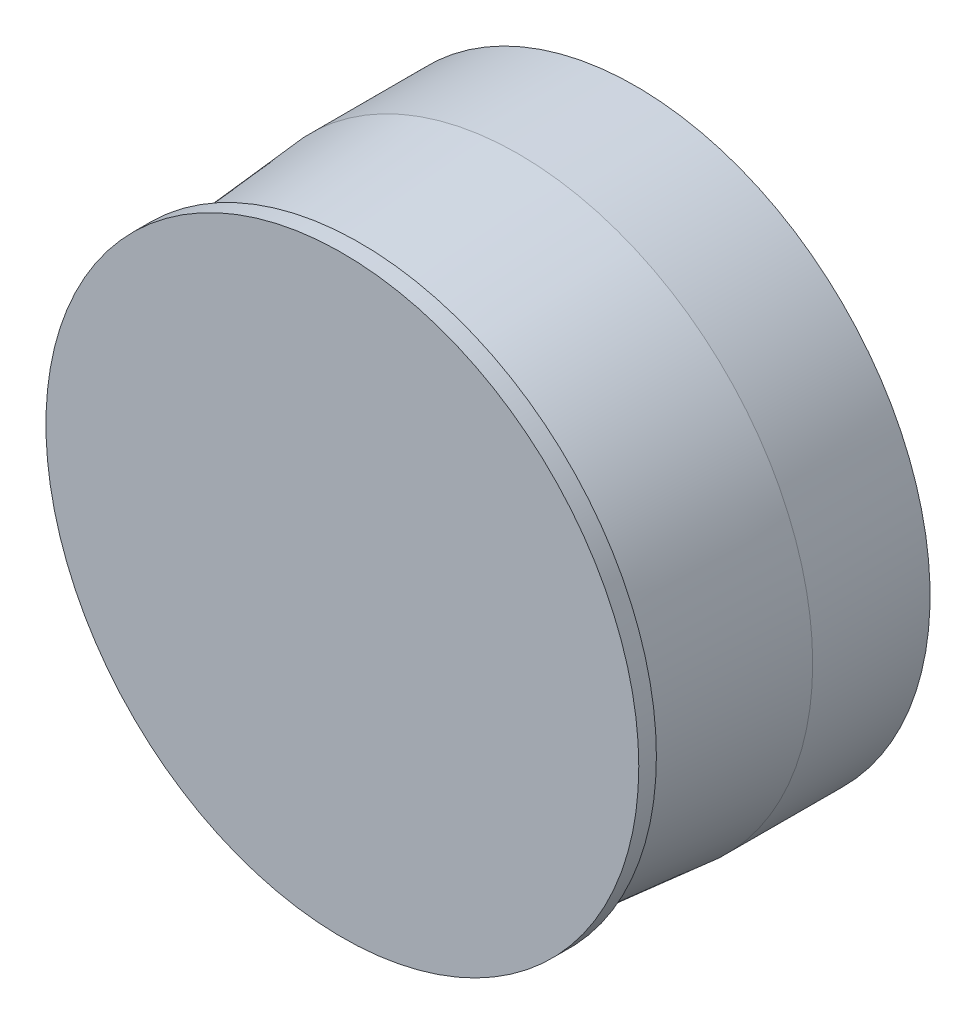
ISO-10303-21;
HEADER;
FILE_DESCRIPTION(('STEP AP214'),'2;1');
FILE_NAME('part.step','',(''),(''),'','','');
FILE_SCHEMA(('AUTOMOTIVE_DESIGN { 1 0 10303 214 1 1 1 1 }'));
ENDSEC;
DATA;
#1=APPLICATION_CONTEXT('core data for automotive mechanical design processes');
#2=APPLICATION_PROTOCOL_DEFINITION('international standard','automotive_design',2000,#1);
#3=PRODUCT_CONTEXT('',#1,'mechanical');
#4=PRODUCT('Part','Part','',(#3));
#5=PRODUCT_RELATED_PRODUCT_CATEGORY('part','',(#4));
#6=PRODUCT_DEFINITION_FORMATION('','',#4);
#7=PRODUCT_DEFINITION_CONTEXT('part definition',#1,'design');
#8=PRODUCT_DEFINITION('design','',#6,#7);
#9=PRODUCT_DEFINITION_SHAPE('','',#8);
#10=(LENGTH_UNIT() NAMED_UNIT(*) SI_UNIT(.MILLI.,.METRE.));
#11=(NAMED_UNIT(*) PLANE_ANGLE_UNIT() SI_UNIT($,.RADIAN.));
#12=(NAMED_UNIT(*) SI_UNIT($,.STERADIAN.) SOLID_ANGLE_UNIT());
#13=UNCERTAINTY_MEASURE_WITH_UNIT(LENGTH_MEASURE(1.E-05),#10,'distance_accuracy_value','');
#14=(GEOMETRIC_REPRESENTATION_CONTEXT(3) GLOBAL_UNCERTAINTY_ASSIGNED_CONTEXT((#13)) GLOBAL_UNIT_ASSIGNED_CONTEXT((#10,
#11,#12)) REPRESENTATION_CONTEXT('',''));
#15=CARTESIAN_POINT('',(0.,0.,0.));
#16=DIRECTION('',(0.,0.,1.));
#17=DIRECTION('',(1.,0.,0.));
#18=AXIS2_PLACEMENT_3D('',#15,#16,#17);
#19=CARTESIAN_POINT('',(0.,0.,0.));
#20=DIRECTION('',(0.,0.,-1.));
#21=DIRECTION('',(1.,0.,0.));
#22=AXIS2_PLACEMENT_3D('',#19,#20,#21);
#23=CONICAL_SURFACE('',#22,47.5,0.0872664625997167);
#24=CARTESIAN_POINT('',(0.,0.,-30.));
#25=DIRECTION('',(0.,0.,-1.));
#26=DIRECTION('',(-1.,0.,0.));
#27=AXIS2_PLACEMENT_3D('',#24,#25,#26);
#28=CIRCLE('',#27,50.1246599057777);
#29=CARTESIAN_POINT('',(-50.1246599057777,0.,-30.));
#30=VERTEX_POINT('',#29);
#31=EDGE_CURVE('E56',#30,#30,#28,.T.);
#32=ORIENTED_EDGE('',*,*,#31,.F.);
#33=EDGE_LOOP('',(#32));
#34=FACE_BOUND('',#33,.T.);
#35=CARTESIAN_POINT('',(0.,0.,-3.));
#36=DIRECTION('',(0.,0.,1.));
#37=DIRECTION('',(1.,0.,0.));
#38=AXIS2_PLACEMENT_3D('',#35,#36,#37);
#39=CIRCLE('',#38,47.7624659905778);
#40=CARTESIAN_POINT('',(47.7624659905778,0.,-3.));
#41=VERTEX_POINT('',#40);
#42=EDGE_CURVE('E10',#41,#41,#39,.F.);
#43=ORIENTED_EDGE('',*,*,#42,.T.);
#44=EDGE_LOOP('',(#43));
#45=FACE_BOUND('',#44,.T.);
#46=ADVANCED_FACE('F39',(#34,#45),#23,.T.);
#47=CARTESIAN_POINT('',(0.,0.,-3.));
#48=DIRECTION('',(0.,0.,1.));
#49=DIRECTION('',(1.,0.,0.));
#50=AXIS2_PLACEMENT_3D('',#47,#48,#49);
#51=CYLINDRICAL_SURFACE('',#50,50.5);
#52=CARTESIAN_POINT('',(0.,0.,-3.));
#53=DIRECTION('',(0.,0.,1.));
#54=DIRECTION('',(1.,0.,0.));
#55=AXIS2_PLACEMENT_3D('',#52,#53,#54);
#56=CIRCLE('',#55,50.5);
#57=CARTESIAN_POINT('',(50.5,0.,-3.));
#58=VERTEX_POINT('',#57);
#59=EDGE_CURVE('E45',#58,#58,#56,.T.);
#60=ORIENTED_EDGE('',*,*,#59,.T.);
#61=EDGE_LOOP('',(#60));
#62=FACE_BOUND('',#61,.T.);
#63=CARTESIAN_POINT('',(0.,0.,0.));
#64=DIRECTION('',(0.,0.,1.));
#65=DIRECTION('',(1.,0.,0.));
#66=AXIS2_PLACEMENT_3D('',#63,#64,#65);
#67=CIRCLE('',#66,50.5);
#68=CARTESIAN_POINT('',(50.5,0.,0.));
#69=VERTEX_POINT('',#68);
#70=EDGE_CURVE('E49',#69,#69,#67,.T.);
#71=ORIENTED_EDGE('',*,*,#70,.F.);
#72=EDGE_LOOP('',(#71));
#73=FACE_BOUND('',#72,.T.);
#74=ADVANCED_FACE('F72',(#62,#73),#51,.T.);
#75=CARTESIAN_POINT('',(0.,0.,-3.));
#76=DIRECTION('',(0.,0.,1.));
#77=DIRECTION('',(1.,0.,0.));
#78=AXIS2_PLACEMENT_3D('',#75,#76,#77);
#79=PLANE('',#78);
#80=ORIENTED_EDGE('',*,*,#42,.F.);
#81=EDGE_LOOP('',(#80));
#82=FACE_BOUND('',#81,.T.);
#83=ORIENTED_EDGE('',*,*,#59,.F.);
#84=EDGE_LOOP('',(#83));
#85=FACE_BOUND('',#84,.T.);
#86=ADVANCED_FACE('F76',(#82,#85),#79,.F.);
#87=CARTESIAN_POINT('',(0.,0.,0.));
#88=DIRECTION('',(0.,0.,1.));
#89=DIRECTION('',(1.,0.,0.));
#90=AXIS2_PLACEMENT_3D('',#87,#88,#89);
#91=PLANE('',#90);
#92=ORIENTED_EDGE('',*,*,#70,.T.);
#93=EDGE_LOOP('',(#92));
#94=FACE_BOUND('',#93,.T.);
#95=ADVANCED_FACE('F67',(#94),#91,.T.);
#96=CARTESIAN_POINT('',(0.,0.,-50.));
#97=DIRECTION('',(0.,0.,1.));
#98=DIRECTION('',(1.,0.,0.));
#99=AXIS2_PLACEMENT_3D('',#96,#97,#98);
#100=CYLINDRICAL_SURFACE('',#99,50.1246599057777);
#101=CARTESIAN_POINT('',(0.,0.,-50.));
#102=DIRECTION('',(0.,0.,-1.));
#103=DIRECTION('',(-1.,0.,0.));
#104=AXIS2_PLACEMENT_3D('',#101,#102,#103);
#105=CIRCLE('',#104,50.1246599057777);
#106=CARTESIAN_POINT('',(-50.1246599057777,0.,-50.));
#107=VERTEX_POINT('',#106);
#108=EDGE_CURVE('E54',#107,#107,#105,.T.);
#109=ORIENTED_EDGE('',*,*,#108,.F.);
#110=EDGE_LOOP('',(#109));
#111=FACE_BOUND('',#110,.T.);
#112=ORIENTED_EDGE('',*,*,#31,.T.);
#113=EDGE_LOOP('',(#112));
#114=FACE_BOUND('',#113,.T.);
#115=ADVANCED_FACE('F64',(#111,#114),#100,.T.);
#116=CARTESIAN_POINT('',(0.,0.,-50.));
#117=DIRECTION('',(0.,0.,-1.));
#118=DIRECTION('',(-1.,0.,0.));
#119=AXIS2_PLACEMENT_3D('',#116,#117,#118);
#120=PLANE('',#119);
#121=ORIENTED_EDGE('',*,*,#108,.T.);
#122=EDGE_LOOP('',(#121));
#123=FACE_BOUND('',#122,.T.);
#124=ADVANCED_FACE('F62',(#123),#120,.T.);
#125=CLOSED_SHELL('',(#46,#74,#86,#95,#115,#124));
#126=MANIFOLD_SOLID_BREP('B2',#125);
#127=ADVANCED_BREP_SHAPE_REPRESENTATION('',(#18,#126),#14);
#128=SHAPE_DEFINITION_REPRESENTATION(#9,#127);
ENDSEC;
END-ISO-10303-21;
